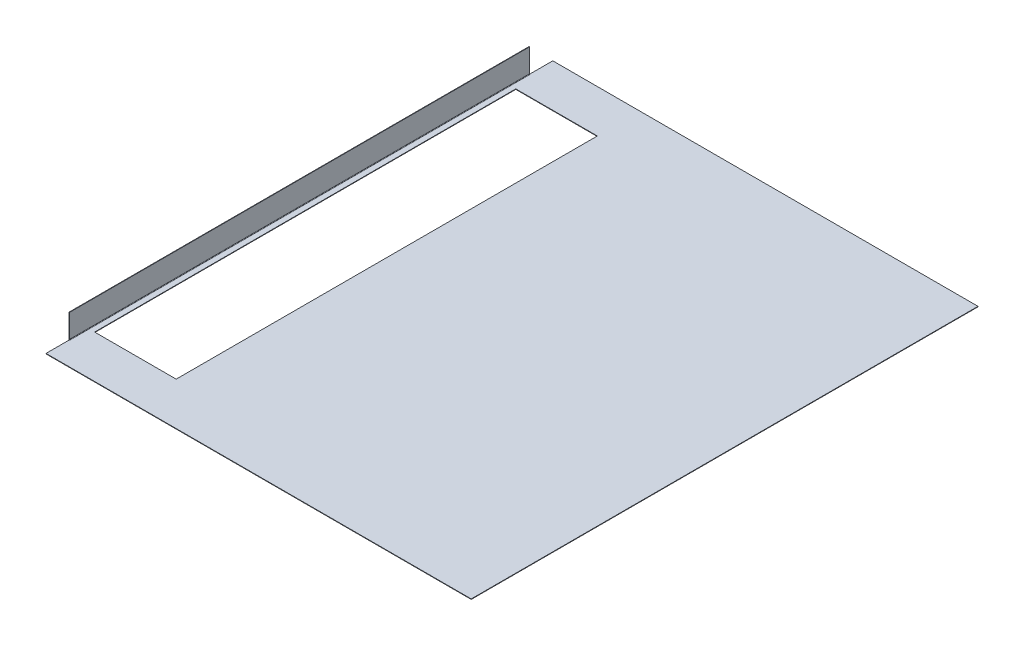
ISO-10303-21;
HEADER;
FILE_DESCRIPTION(('STEP AP214'),'2;1');
FILE_NAME('part.step','',(''),(''),'','','');
FILE_SCHEMA(('AUTOMOTIVE_DESIGN { 1 0 10303 214 1 1 1 1 }'));
ENDSEC;
DATA;
#1=APPLICATION_CONTEXT('core data for automotive mechanical design processes');
#2=APPLICATION_PROTOCOL_DEFINITION('international standard','automotive_design',2000,#1);
#3=PRODUCT_CONTEXT('',#1,'mechanical');
#4=PRODUCT('Part','Part','',(#3));
#5=PRODUCT_RELATED_PRODUCT_CATEGORY('part','',(#4));
#6=PRODUCT_DEFINITION_FORMATION('','',#4);
#7=PRODUCT_DEFINITION_CONTEXT('part definition',#1,'design');
#8=PRODUCT_DEFINITION('design','',#6,#7);
#9=PRODUCT_DEFINITION_SHAPE('','',#8);
#10=(LENGTH_UNIT() NAMED_UNIT(*) SI_UNIT(.MILLI.,.METRE.));
#11=(NAMED_UNIT(*) PLANE_ANGLE_UNIT() SI_UNIT($,.RADIAN.));
#12=(NAMED_UNIT(*) SI_UNIT($,.STERADIAN.) SOLID_ANGLE_UNIT());
#13=UNCERTAINTY_MEASURE_WITH_UNIT(LENGTH_MEASURE(1.E-05),#10,'distance_accuracy_value','');
#14=(GEOMETRIC_REPRESENTATION_CONTEXT(3) GLOBAL_UNCERTAINTY_ASSIGNED_CONTEXT((#13)) GLOBAL_UNIT_ASSIGNED_CONTEXT((#10,
#11,#12)) REPRESENTATION_CONTEXT('',''));
#15=CARTESIAN_POINT('',(0.,0.,0.));
#16=DIRECTION('',(0.,0.,1.));
#17=DIRECTION('',(1.,0.,0.));
#18=AXIS2_PLACEMENT_3D('',#15,#16,#17);
#19=CARTESIAN_POINT('',(-365.,0.,395.));
#20=DIRECTION('',(0.,0.,-1.));
#21=DIRECTION('',(-1.,0.,0.));
#22=AXIS2_PLACEMENT_3D('',#19,#20,#21);
#23=PLANE('',#22);
#24=DIRECTION('',(0.,-1.,0.));
#25=VECTOR('',#24,1.);
#26=CARTESIAN_POINT('',(-365.,0.,395.));
#27=LINE('',#26,#25);
#28=CARTESIAN_POINT('',(-365.,-0.585640646055121,395.));
#29=VERTEX_POINT('',#28);
#30=CARTESIAN_POINT('',(-365.,-0.8,395.));
#31=VERTEX_POINT('',#30);
#32=EDGE_CURVE('E52',#29,#31,#27,.T.);
#33=ORIENTED_EDGE('',*,*,#32,.F.);
#34=CARTESIAN_POINT('',(-364.2,0.800000000000026,395.));
#35=DIRECTION('',(0.,0.,1.));
#36=DIRECTION('',(1.,0.,0.));
#37=AXIS2_PLACEMENT_3D('',#34,#35,#36);
#38=CIRCLE('',#37,1.60000000000008);
#39=CARTESIAN_POINT('',(-364.2,-0.8,395.));
#40=VERTEX_POINT('',#39);
#41=EDGE_CURVE('E11',#29,#40,#38,.T.);
#42=ORIENTED_EDGE('',*,*,#41,.T.);
#43=DIRECTION('',(1.,0.,0.));
#44=VECTOR('',#43,1.);
#45=CARTESIAN_POINT('',(365.000000000058,-0.8,394.999999999949));
#46=LINE('',#45,#44);
#47=EDGE_CURVE('E230',#31,#40,#46,.T.);
#48=ORIENTED_EDGE('',*,*,#47,.F.);
#49=EDGE_LOOP('',(#33,#42,#48));
#50=FACE_BOUND('',#49,.T.);
#51=ADVANCED_FACE('F35',(#50),#23,.T.);
#52=CARTESIAN_POINT('',(-364.2,0.,-395.));
#53=DIRECTION('',(0.,0.,1.));
#54=DIRECTION('',(0.,-1.,0.));
#55=AXIS2_PLACEMENT_3D('',#52,#53,#54);
#56=PLANE('',#55);
#57=DIRECTION('',(-1.,0.,0.));
#58=VECTOR('',#57,1.);
#59=CARTESIAN_POINT('',(365.,-0.8,-395.));
#60=LINE('',#59,#58);
#61=CARTESIAN_POINT('',(-364.2,-0.8,-395.));
#62=VERTEX_POINT('',#61);
#63=CARTESIAN_POINT('',(-365.,-0.8,-395.));
#64=VERTEX_POINT('',#63);
#65=EDGE_CURVE('E219',#62,#64,#60,.T.);
#66=ORIENTED_EDGE('',*,*,#65,.F.);
#67=CARTESIAN_POINT('',(-364.2,0.800000000000026,-395.));
#68=DIRECTION('',(0.,0.,1.));
#69=DIRECTION('',(1.,0.,0.));
#70=AXIS2_PLACEMENT_3D('',#67,#68,#69);
#71=CIRCLE('',#70,1.60000000000008);
#72=CARTESIAN_POINT('',(-365.,-0.585640646055121,-395.));
#73=VERTEX_POINT('',#72);
#74=EDGE_CURVE('E207',#62,#73,#71,.F.);
#75=ORIENTED_EDGE('',*,*,#74,.T.);
#76=DIRECTION('',(0.,-1.,0.));
#77=VECTOR('',#76,1.);
#78=CARTESIAN_POINT('',(-365.,0.,-395.));
#79=LINE('',#78,#77);
#80=EDGE_CURVE('E223',#73,#64,#79,.T.);
#81=ORIENTED_EDGE('',*,*,#80,.T.);
#82=EDGE_LOOP('',(#66,#75,#81));
#83=FACE_BOUND('',#82,.T.);
#84=ADVANCED_FACE('F343',(#83),#56,.T.);
#85=CARTESIAN_POINT('',(-365.,-0.8,435.));
#86=DIRECTION('',(-1.,0.,0.));
#87=DIRECTION('',(0.,0.,1.));
#88=AXIS2_PLACEMENT_3D('',#85,#86,#87);
#89=PLANE('',#88);
#90=DIRECTION('',(0.,0.,1.));
#91=VECTOR('',#90,1.);
#92=CARTESIAN_POINT('',(-365.,0.,435.));
#93=LINE('',#92,#91);
#94=CARTESIAN_POINT('',(-365.,0.,395.));
#95=VERTEX_POINT('',#94);
#96=CARTESIAN_POINT('',(-365.,0.,435.));
#97=VERTEX_POINT('',#96);
#98=EDGE_CURVE('E284',#95,#97,#93,.T.);
#99=ORIENTED_EDGE('',*,*,#98,.F.);
#100=EDGE_CURVE('E220',#95,#29,#27,.T.);
#101=ORIENTED_EDGE('',*,*,#100,.T.);
#102=ORIENTED_EDGE('',*,*,#32,.T.);
#103=DIRECTION('',(0.,0.,1.));
#104=VECTOR('',#103,1.);
#105=CARTESIAN_POINT('',(-365.,-0.8,435.));
#106=LINE('',#105,#104);
#107=CARTESIAN_POINT('',(-365.,-0.8,435.));
#108=VERTEX_POINT('',#107);
#109=EDGE_CURVE('E272',#31,#108,#106,.T.);
#110=ORIENTED_EDGE('',*,*,#109,.T.);
#111=DIRECTION('',(0.,1.,0.));
#112=VECTOR('',#111,1.);
#113=CARTESIAN_POINT('',(-365.,-0.8,435.));
#114=LINE('',#113,#112);
#115=EDGE_CURVE('E290',#108,#97,#114,.T.);
#116=ORIENTED_EDGE('',*,*,#115,.T.);
#117=EDGE_LOOP('',(#99,#101,#102,#110,#116));
#118=FACE_BOUND('',#117,.T.);
#119=ADVANCED_FACE('F348',(#118),#89,.T.);
#120=CARTESIAN_POINT('',(-365.,-0.8,-435.));
#121=VERTEX_POINT('',#120);
#122=EDGE_CURVE('E273',#121,#64,#106,.T.);
#123=ORIENTED_EDGE('',*,*,#122,.T.);
#124=ORIENTED_EDGE('',*,*,#80,.F.);
#125=CARTESIAN_POINT('',(-365.,0.,-395.));
#126=VERTEX_POINT('',#125);
#127=EDGE_CURVE('E224',#126,#73,#79,.T.);
#128=ORIENTED_EDGE('',*,*,#127,.F.);
#129=CARTESIAN_POINT('',(-365.,0.,-435.));
#130=VERTEX_POINT('',#129);
#131=EDGE_CURVE('E285',#130,#126,#93,.T.);
#132=ORIENTED_EDGE('',*,*,#131,.F.);
#133=DIRECTION('',(0.,1.,0.));
#134=VECTOR('',#133,1.);
#135=CARTESIAN_POINT('',(-365.,-0.8,-435.));
#136=LINE('',#135,#134);
#137=EDGE_CURVE('E292',#121,#130,#136,.T.);
#138=ORIENTED_EDGE('',*,*,#137,.F.);
#139=EDGE_LOOP('',(#123,#124,#128,#132,#138));
#140=FACE_BOUND('',#139,.T.);
#141=ADVANCED_FACE('F315',(#140),#89,.T.);
#142=CARTESIAN_POINT('',(365.,-0.8,-435.));
#143=DIRECTION('',(0.,-1.,0.));
#144=DIRECTION('',(0.,0.,-1.));
#145=AXIS2_PLACEMENT_3D('',#142,#143,#144);
#146=PLANE('',#145);
#147=DIRECTION('',(0.,0.,-1.));
#148=VECTOR('',#147,1.);
#149=CARTESIAN_POINT('',(-215.,-0.8,361.5));
#150=LINE('',#149,#148);
#151=CARTESIAN_POINT('',(-215.,-0.8,361.5));
#152=VERTEX_POINT('',#151);
#153=CARTESIAN_POINT('',(-215.,-0.8,-361.5));
#154=VERTEX_POINT('',#153);
#155=EDGE_CURVE('E233',#152,#154,#150,.T.);
#156=ORIENTED_EDGE('',*,*,#155,.T.);
#157=DIRECTION('',(-1.,0.,0.));
#158=VECTOR('',#157,1.);
#159=CARTESIAN_POINT('',(-355.,-0.8,-361.5));
#160=LINE('',#159,#158);
#161=CARTESIAN_POINT('',(-355.,-0.8,-361.5));
#162=VERTEX_POINT('',#161);
#163=EDGE_CURVE('E236',#154,#162,#160,.T.);
#164=ORIENTED_EDGE('',*,*,#163,.T.);
#165=DIRECTION('',(0.,0.,1.));
#166=VECTOR('',#165,1.);
#167=CARTESIAN_POINT('',(-355.,-0.8,361.5));
#168=LINE('',#167,#166);
#169=CARTESIAN_POINT('',(-355.,-0.8,361.5));
#170=VERTEX_POINT('',#169);
#171=EDGE_CURVE('E240',#162,#170,#168,.T.);
#172=ORIENTED_EDGE('',*,*,#171,.T.);
#173=DIRECTION('',(1.,0.,0.));
#174=VECTOR('',#173,1.);
#175=CARTESIAN_POINT('',(-355.,-0.8,361.5));
#176=LINE('',#175,#174);
#177=EDGE_CURVE('E243',#170,#152,#176,.T.);
#178=ORIENTED_EDGE('',*,*,#177,.T.);
#179=EDGE_LOOP('',(#156,#164,#172,#178));
#180=FACE_BOUND('',#179,.T.);
#181=ORIENTED_EDGE('',*,*,#109,.F.);
#182=ORIENTED_EDGE('',*,*,#47,.T.);
#183=DIRECTION('',(0.,0.,1.));
#184=VECTOR('',#183,1.);
#185=CARTESIAN_POINT('',(-364.2,-0.800000000000052,395.));
#186=LINE('',#185,#184);
#187=EDGE_CURVE('E163',#40,#62,#186,.F.);
#188=ORIENTED_EDGE('',*,*,#187,.T.);
#189=ORIENTED_EDGE('',*,*,#65,.T.);
#190=ORIENTED_EDGE('',*,*,#122,.F.);
#191=DIRECTION('',(-1.,0.,0.));
#192=VECTOR('',#191,1.);
#193=CARTESIAN_POINT('',(-365.,-0.8,-435.));
#194=LINE('',#193,#192);
#195=CARTESIAN_POINT('',(365.,-0.8,-435.));
#196=VERTEX_POINT('',#195);
#197=EDGE_CURVE('E268',#196,#121,#194,.T.);
#198=ORIENTED_EDGE('',*,*,#197,.F.);
#199=DIRECTION('',(0.,0.,-1.));
#200=VECTOR('',#199,1.);
#201=CARTESIAN_POINT('',(365.,-0.8,435.));
#202=LINE('',#201,#200);
#203=CARTESIAN_POINT('',(365.,-0.8,435.));
#204=VERTEX_POINT('',#203);
#205=EDGE_CURVE('E265',#204,#196,#202,.T.);
#206=ORIENTED_EDGE('',*,*,#205,.F.);
#207=DIRECTION('',(1.,0.,0.));
#208=VECTOR('',#207,1.);
#209=CARTESIAN_POINT('',(-365.,-0.8,435.));
#210=LINE('',#209,#208);
#211=EDGE_CURVE('E276',#108,#204,#210,.T.);
#212=ORIENTED_EDGE('',*,*,#211,.F.);
#213=EDGE_LOOP('',(#181,#182,#188,#189,#190,#198,#206,#212));
#214=FACE_BOUND('',#213,.T.);
#215=ADVANCED_FACE('F311',(#180,#214),#146,.T.);
#216=CARTESIAN_POINT('',(365.,0.,-435.));
#217=DIRECTION('',(0.,-1.,0.));
#218=DIRECTION('',(0.,0.,-1.));
#219=AXIS2_PLACEMENT_3D('',#216,#217,#218);
#220=PLANE('',#219);
#221=DIRECTION('',(-1.,0.,0.));
#222=VECTOR('',#221,1.);
#223=CARTESIAN_POINT('',(-355.,0.,-361.5));
#224=LINE('',#223,#222);
#225=CARTESIAN_POINT('',(-215.,0.,-361.5));
#226=VERTEX_POINT('',#225);
#227=CARTESIAN_POINT('',(-355.,0.,-361.5));
#228=VERTEX_POINT('',#227);
#229=EDGE_CURVE('E248',#226,#228,#224,.T.);
#230=ORIENTED_EDGE('',*,*,#229,.F.);
#231=DIRECTION('',(0.,0.,-1.));
#232=VECTOR('',#231,1.);
#233=CARTESIAN_POINT('',(-215.,0.,361.5));
#234=LINE('',#233,#232);
#235=CARTESIAN_POINT('',(-215.,0.,361.5));
#236=VERTEX_POINT('',#235);
#237=EDGE_CURVE('E232',#236,#226,#234,.T.);
#238=ORIENTED_EDGE('',*,*,#237,.F.);
#239=DIRECTION('',(1.,0.,0.));
#240=VECTOR('',#239,1.);
#241=CARTESIAN_POINT('',(-355.,0.,361.5));
#242=LINE('',#241,#240);
#243=CARTESIAN_POINT('',(-355.,0.,361.5));
#244=VERTEX_POINT('',#243);
#245=EDGE_CURVE('E237',#244,#236,#242,.T.);
#246=ORIENTED_EDGE('',*,*,#245,.F.);
#247=DIRECTION('',(0.,0.,1.));
#248=VECTOR('',#247,1.);
#249=CARTESIAN_POINT('',(-355.,0.,361.5));
#250=LINE('',#249,#248);
#251=EDGE_CURVE('E251',#228,#244,#250,.T.);
#252=ORIENTED_EDGE('',*,*,#251,.F.);
#253=EDGE_LOOP('',(#230,#238,#246,#252));
#254=FACE_BOUND('',#253,.T.);
#255=DIRECTION('',(1.,-1.26038502551427E-13,0.));
#256=VECTOR('',#255,1.);
#257=CARTESIAN_POINT('',(-365.,0.,395.));
#258=LINE('',#257,#256);
#259=CARTESIAN_POINT('',(-364.2,0.,395.));
#260=VERTEX_POINT('',#259);
#261=EDGE_CURVE('E217',#95,#260,#258,.T.);
#262=ORIENTED_EDGE('',*,*,#261,.F.);
#263=ORIENTED_EDGE('',*,*,#98,.T.);
#264=DIRECTION('',(1.,0.,0.));
#265=VECTOR('',#264,1.);
#266=CARTESIAN_POINT('',(-365.,0.,435.));
#267=LINE('',#266,#265);
#268=CARTESIAN_POINT('',(365.,0.,435.));
#269=VERTEX_POINT('',#268);
#270=EDGE_CURVE('E269',#97,#269,#267,.T.);
#271=ORIENTED_EDGE('',*,*,#270,.T.);
#272=DIRECTION('',(0.,0.,-1.));
#273=VECTOR('',#272,1.);
#274=CARTESIAN_POINT('',(365.,0.,435.));
#275=LINE('',#274,#273);
#276=CARTESIAN_POINT('',(365.,0.,-435.));
#277=VERTEX_POINT('',#276);
#278=EDGE_CURVE('E258',#269,#277,#275,.T.);
#279=ORIENTED_EDGE('',*,*,#278,.T.);
#280=DIRECTION('',(-1.,0.,0.));
#281=VECTOR('',#280,1.);
#282=CARTESIAN_POINT('',(-365.,0.,-435.));
#283=LINE('',#282,#281);
#284=EDGE_CURVE('E281',#277,#130,#283,.T.);
#285=ORIENTED_EDGE('',*,*,#284,.T.);
#286=ORIENTED_EDGE('',*,*,#131,.T.);
#287=DIRECTION('',(-1.,0.,0.));
#288=VECTOR('',#287,1.);
#289=CARTESIAN_POINT('',(-364.2,0.,-395.));
#290=LINE('',#289,#288);
#291=CARTESIAN_POINT('',(-364.2,0.,-395.));
#292=VERTEX_POINT('',#291);
#293=EDGE_CURVE('E209',#292,#126,#290,.T.);
#294=ORIENTED_EDGE('',*,*,#293,.F.);
#295=DIRECTION('',(0.,0.,1.));
#296=VECTOR('',#295,1.);
#297=CARTESIAN_POINT('',(-364.2,0.,395.));
#298=LINE('',#297,#296);
#299=EDGE_CURVE('E213',#260,#292,#298,.F.);
#300=ORIENTED_EDGE('',*,*,#299,.F.);
#301=EDGE_LOOP('',(#262,#263,#271,#279,#285,#286,#294,#300));
#302=FACE_BOUND('',#301,.T.);
#303=ADVANCED_FACE('F302',(#254,#302),#220,.F.);
#304=CARTESIAN_POINT('',(365.,-0.8,435.));
#305=DIRECTION('',(1.,0.,0.));
#306=DIRECTION('',(0.,0.,-1.));
#307=AXIS2_PLACEMENT_3D('',#304,#305,#306);
#308=PLANE('',#307);
#309=ORIENTED_EDGE('',*,*,#278,.F.);
#310=DIRECTION('',(0.,1.,0.));
#311=VECTOR('',#310,1.);
#312=CARTESIAN_POINT('',(365.,-0.8,435.));
#313=LINE('',#312,#311);
#314=EDGE_CURVE('E44',#204,#269,#313,.T.);
#315=ORIENTED_EDGE('',*,*,#314,.F.);
#316=ORIENTED_EDGE('',*,*,#205,.T.);
#317=DIRECTION('',(0.,1.,0.));
#318=VECTOR('',#317,1.);
#319=CARTESIAN_POINT('',(365.,-0.8,-435.));
#320=LINE('',#319,#318);
#321=EDGE_CURVE('E39',#196,#277,#320,.T.);
#322=ORIENTED_EDGE('',*,*,#321,.T.);
#323=EDGE_LOOP('',(#309,#315,#316,#322));
#324=FACE_BOUND('',#323,.T.);
#325=ADVANCED_FACE('F37',(#324),#308,.T.);
#326=CARTESIAN_POINT('',(-365.,-0.8,435.));
#327=DIRECTION('',(0.,0.,1.));
#328=DIRECTION('',(1.,0.,0.));
#329=AXIS2_PLACEMENT_3D('',#326,#327,#328);
#330=PLANE('',#329);
#331=ORIENTED_EDGE('',*,*,#270,.F.);
#332=ORIENTED_EDGE('',*,*,#115,.F.);
#333=ORIENTED_EDGE('',*,*,#211,.T.);
#334=ORIENTED_EDGE('',*,*,#314,.T.);
#335=EDGE_LOOP('',(#331,#332,#333,#334));
#336=FACE_BOUND('',#335,.T.);
#337=ADVANCED_FACE('F307',(#336),#330,.T.);
#338=CARTESIAN_POINT('',(-365.,-0.8,-435.));
#339=DIRECTION('',(0.,0.,-1.));
#340=DIRECTION('',(-1.,0.,0.));
#341=AXIS2_PLACEMENT_3D('',#338,#339,#340);
#342=PLANE('',#341);
#343=ORIENTED_EDGE('',*,*,#284,.F.);
#344=ORIENTED_EDGE('',*,*,#321,.F.);
#345=ORIENTED_EDGE('',*,*,#197,.T.);
#346=ORIENTED_EDGE('',*,*,#137,.T.);
#347=EDGE_LOOP('',(#343,#344,#345,#346));
#348=FACE_BOUND('',#347,.T.);
#349=ADVANCED_FACE('F300',(#348),#342,.T.);
#350=CARTESIAN_POINT('',(-215.,-0.8,361.5));
#351=DIRECTION('',(1.,0.,0.));
#352=DIRECTION('',(0.,0.,-1.));
#353=AXIS2_PLACEMENT_3D('',#350,#351,#352);
#354=PLANE('',#353);
#355=ORIENTED_EDGE('',*,*,#237,.T.);
#356=DIRECTION('',(0.,1.,0.));
#357=VECTOR('',#356,1.);
#358=CARTESIAN_POINT('',(-215.,-0.8,-361.5));
#359=LINE('',#358,#357);
#360=EDGE_CURVE('E246',#154,#226,#359,.T.);
#361=ORIENTED_EDGE('',*,*,#360,.F.);
#362=ORIENTED_EDGE('',*,*,#155,.F.);
#363=DIRECTION('',(0.,1.,0.));
#364=VECTOR('',#363,1.);
#365=CARTESIAN_POINT('',(-215.,-0.8,361.5));
#366=LINE('',#365,#364);
#367=EDGE_CURVE('E256',#152,#236,#366,.T.);
#368=ORIENTED_EDGE('',*,*,#367,.T.);
#369=EDGE_LOOP('',(#355,#361,#362,#368));
#370=FACE_BOUND('',#369,.T.);
#371=ADVANCED_FACE('F357',(#370),#354,.F.);
#372=CARTESIAN_POINT('',(-355.,-0.8,361.5));
#373=DIRECTION('',(0.,0.,1.));
#374=DIRECTION('',(1.,0.,0.));
#375=AXIS2_PLACEMENT_3D('',#372,#373,#374);
#376=PLANE('',#375);
#377=ORIENTED_EDGE('',*,*,#245,.T.);
#378=ORIENTED_EDGE('',*,*,#367,.F.);
#379=ORIENTED_EDGE('',*,*,#177,.F.);
#380=DIRECTION('',(0.,1.,0.));
#381=VECTOR('',#380,1.);
#382=CARTESIAN_POINT('',(-355.,-0.8,361.5));
#383=LINE('',#382,#381);
#384=EDGE_CURVE('E259',#170,#244,#383,.T.);
#385=ORIENTED_EDGE('',*,*,#384,.T.);
#386=EDGE_LOOP('',(#377,#378,#379,#385));
#387=FACE_BOUND('',#386,.T.);
#388=ADVANCED_FACE('F353',(#387),#376,.F.);
#389=CARTESIAN_POINT('',(-355.,-0.8,361.5));
#390=DIRECTION('',(-1.,0.,0.));
#391=DIRECTION('',(0.,0.,1.));
#392=AXIS2_PLACEMENT_3D('',#389,#390,#391);
#393=PLANE('',#392);
#394=ORIENTED_EDGE('',*,*,#251,.T.);
#395=ORIENTED_EDGE('',*,*,#384,.F.);
#396=ORIENTED_EDGE('',*,*,#171,.F.);
#397=DIRECTION('',(0.,1.,0.));
#398=VECTOR('',#397,1.);
#399=CARTESIAN_POINT('',(-355.,-0.8,-361.5));
#400=LINE('',#399,#398);
#401=EDGE_CURVE('E261',#162,#228,#400,.T.);
#402=ORIENTED_EDGE('',*,*,#401,.T.);
#403=EDGE_LOOP('',(#394,#395,#396,#402));
#404=FACE_BOUND('',#403,.T.);
#405=ADVANCED_FACE('F356',(#404),#393,.F.);
#406=CARTESIAN_POINT('',(-355.,-0.8,-361.5));
#407=DIRECTION('',(0.,0.,-1.));
#408=DIRECTION('',(-1.,0.,0.));
#409=AXIS2_PLACEMENT_3D('',#406,#407,#408);
#410=PLANE('',#409);
#411=ORIENTED_EDGE('',*,*,#229,.T.);
#412=ORIENTED_EDGE('',*,*,#401,.F.);
#413=ORIENTED_EDGE('',*,*,#163,.F.);
#414=ORIENTED_EDGE('',*,*,#360,.T.);
#415=EDGE_LOOP('',(#411,#412,#413,#414));
#416=FACE_BOUND('',#415,.T.);
#417=ADVANCED_FACE('F361',(#416),#410,.F.);
#418=CARTESIAN_POINT('',(-364.2,0.800000000000026,395.));
#419=DIRECTION('',(0.,0.,-1.));
#420=DIRECTION('',(-1.,0.,0.));
#421=AXIS2_PLACEMENT_3D('',#418,#419,#420);
#422=PLANE('',#421);
#423=ORIENTED_EDGE('',*,*,#100,.F.);
#424=ORIENTED_EDGE('',*,*,#261,.T.);
#425=CARTESIAN_POINT('',(-364.2,0.800000000000026,395.));
#426=DIRECTION('',(0.,0.,1.));
#427=DIRECTION('',(1.,0.,0.));
#428=AXIS2_PLACEMENT_3D('',#425,#426,#427);
#429=CIRCLE('',#428,0.800000000000078);
#430=CARTESIAN_POINT('',(-365.,0.800000000000023,395.));
#431=VERTEX_POINT('',#430);
#432=EDGE_CURVE('E171',#431,#260,#429,.T.);
#433=ORIENTED_EDGE('',*,*,#432,.F.);
#434=DIRECTION('',(-1.,0.,0.));
#435=VECTOR('',#434,1.);
#436=CARTESIAN_POINT('',(-365.,0.800000000000023,395.));
#437=LINE('',#436,#435);
#438=CARTESIAN_POINT('',(-365.8,0.80000000000002,395.));
#439=VERTEX_POINT('',#438);
#440=EDGE_CURVE('E167',#431,#439,#437,.T.);
#441=ORIENTED_EDGE('',*,*,#440,.T.);
#442=EDGE_CURVE('E46',#439,#29,#38,.T.);
#443=ORIENTED_EDGE('',*,*,#442,.T.);
#444=EDGE_LOOP('',(#423,#424,#433,#441,#443));
#445=FACE_BOUND('',#444,.T.);
#446=ADVANCED_FACE('F168',(#445),#422,.F.);
#447=CARTESIAN_POINT('',(-364.2,0.800000000000026,-395.));
#448=DIRECTION('',(0.,0.,-1.));
#449=DIRECTION('',(-1.,0.,0.));
#450=AXIS2_PLACEMENT_3D('',#447,#448,#449);
#451=PLANE('',#450);
#452=CARTESIAN_POINT('',(-364.2,0.800000000000026,-395.));
#453=DIRECTION('',(0.,0.,1.));
#454=DIRECTION('',(1.,0.,0.));
#455=AXIS2_PLACEMENT_3D('',#452,#453,#454);
#456=CIRCLE('',#455,0.800000000000078);
#457=CARTESIAN_POINT('',(-365.,0.800000000000023,-395.));
#458=VERTEX_POINT('',#457);
#459=EDGE_CURVE('E164',#292,#458,#456,.F.);
#460=ORIENTED_EDGE('',*,*,#459,.F.);
#461=ORIENTED_EDGE('',*,*,#293,.T.);
#462=ORIENTED_EDGE('',*,*,#127,.T.);
#463=CARTESIAN_POINT('',(-365.8,0.80000000000002,-395.));
#464=VERTEX_POINT('',#463);
#465=EDGE_CURVE('E206',#73,#464,#71,.F.);
#466=ORIENTED_EDGE('',*,*,#465,.T.);
#467=DIRECTION('',(-1.,0.,0.));
#468=VECTOR('',#467,1.);
#469=CARTESIAN_POINT('',(-365.,0.800000000000023,-395.));
#470=LINE('',#469,#468);
#471=EDGE_CURVE('E323',#458,#464,#470,.T.);
#472=ORIENTED_EDGE('',*,*,#471,.F.);
#473=EDGE_LOOP('',(#460,#461,#462,#466,#472));
#474=FACE_BOUND('',#473,.T.);
#475=ADVANCED_FACE('F322',(#474),#451,.T.);
#476=CARTESIAN_POINT('',(-364.2,0.800000000000026,395.));
#477=DIRECTION('',(0.,0.,1.));
#478=DIRECTION('',(-1.,0.,0.));
#479=AXIS2_PLACEMENT_3D('',#476,#477,#478);
#480=CYLINDRICAL_SURFACE('',#479,1.60000000000008);
#481=ORIENTED_EDGE('',*,*,#187,.F.);
#482=ORIENTED_EDGE('',*,*,#41,.F.);
#483=ORIENTED_EDGE('',*,*,#442,.F.);
#484=DIRECTION('',(0.,0.,-1.));
#485=VECTOR('',#484,1.);
#486=CARTESIAN_POINT('',(-365.8,0.800000000000023,-395.));
#487=LINE('',#486,#485);
#488=EDGE_CURVE('E159',#439,#464,#487,.T.);
#489=ORIENTED_EDGE('',*,*,#488,.T.);
#490=ORIENTED_EDGE('',*,*,#465,.F.);
#491=ORIENTED_EDGE('',*,*,#74,.F.);
#492=EDGE_LOOP('',(#481,#482,#483,#489,#490,#491));
#493=FACE_BOUND('',#492,.T.);
#494=ADVANCED_FACE('F156',(#493),#480,.T.);
#495=CARTESIAN_POINT('',(-364.2,0.800000000000026,395.));
#496=DIRECTION('',(0.,0.,1.));
#497=DIRECTION('',(-1.,0.,0.));
#498=AXIS2_PLACEMENT_3D('',#495,#496,#497);
#499=CYLINDRICAL_SURFACE('',#498,0.800000000000078);
#500=ORIENTED_EDGE('',*,*,#299,.T.);
#501=ORIENTED_EDGE('',*,*,#459,.T.);
#502=DIRECTION('',(0.,0.,1.));
#503=VECTOR('',#502,1.);
#504=CARTESIAN_POINT('',(-365.,0.800000000000023,-395.));
#505=LINE('',#504,#503);
#506=EDGE_CURVE('E175',#458,#431,#505,.T.);
#507=ORIENTED_EDGE('',*,*,#506,.T.);
#508=ORIENTED_EDGE('',*,*,#432,.T.);
#509=EDGE_LOOP('',(#500,#501,#507,#508));
#510=FACE_BOUND('',#509,.T.);
#511=ADVANCED_FACE('F320',(#510),#499,.F.);
#512=CARTESIAN_POINT('',(-365.8,0.,-395.));
#513=DIRECTION('',(0.,0.,1.));
#514=DIRECTION('',(1.,0.,0.));
#515=AXIS2_PLACEMENT_3D('',#512,#513,#514);
#516=PLANE('',#515);
#517=ORIENTED_EDGE('',*,*,#471,.T.);
#518=DIRECTION('',(0.,-1.,0.));
#519=VECTOR('',#518,1.);
#520=CARTESIAN_POINT('',(-365.8,0.,-395.));
#521=LINE('',#520,#519);
#522=CARTESIAN_POINT('',(-365.8,40.8,-395.));
#523=VERTEX_POINT('',#522);
#524=EDGE_CURVE('E183',#523,#464,#521,.T.);
#525=ORIENTED_EDGE('',*,*,#524,.F.);
#526=DIRECTION('',(1.,0.,0.));
#527=VECTOR('',#526,1.);
#528=CARTESIAN_POINT('',(-365.8,40.8,-395.));
#529=LINE('',#528,#527);
#530=CARTESIAN_POINT('',(-365.,40.8,-395.));
#531=VERTEX_POINT('',#530);
#532=EDGE_CURVE('E192',#523,#531,#529,.T.);
#533=ORIENTED_EDGE('',*,*,#532,.T.);
#534=DIRECTION('',(0.,-1.,0.));
#535=VECTOR('',#534,1.);
#536=CARTESIAN_POINT('',(-365.,0.,-395.));
#537=LINE('',#536,#535);
#538=EDGE_CURVE('E184',#531,#458,#537,.T.);
#539=ORIENTED_EDGE('',*,*,#538,.T.);
#540=EDGE_LOOP('',(#517,#525,#533,#539));
#541=FACE_BOUND('',#540,.T.);
#542=ADVANCED_FACE('F331',(#541),#516,.F.);
#543=CARTESIAN_POINT('',(-365.8,40.8,395.));
#544=DIRECTION('',(0.,0.,-1.));
#545=DIRECTION('',(-1.,0.,0.));
#546=AXIS2_PLACEMENT_3D('',#543,#544,#545);
#547=PLANE('',#546);
#548=ORIENTED_EDGE('',*,*,#440,.F.);
#549=DIRECTION('',(0.,1.,0.));
#550=VECTOR('',#549,1.);
#551=CARTESIAN_POINT('',(-365.,40.8,395.));
#552=LINE('',#551,#550);
#553=CARTESIAN_POINT('',(-365.,40.8,395.));
#554=VERTEX_POINT('',#553);
#555=EDGE_CURVE('E199',#431,#554,#552,.T.);
#556=ORIENTED_EDGE('',*,*,#555,.T.);
#557=DIRECTION('',(1.,0.,0.));
#558=VECTOR('',#557,1.);
#559=CARTESIAN_POINT('',(-365.8,40.8,395.));
#560=LINE('',#559,#558);
#561=CARTESIAN_POINT('',(-365.8,40.8,395.));
#562=VERTEX_POINT('',#561);
#563=EDGE_CURVE('E188',#562,#554,#560,.T.);
#564=ORIENTED_EDGE('',*,*,#563,.F.);
#565=DIRECTION('',(0.,1.,0.));
#566=VECTOR('',#565,1.);
#567=CARTESIAN_POINT('',(-365.8,40.8,395.));
#568=LINE('',#567,#566);
#569=EDGE_CURVE('E180',#439,#562,#568,.T.);
#570=ORIENTED_EDGE('',*,*,#569,.F.);
#571=EDGE_LOOP('',(#548,#556,#564,#570));
#572=FACE_BOUND('',#571,.T.);
#573=ADVANCED_FACE('F186',(#572),#547,.F.);
#574=CARTESIAN_POINT('',(-365.8,40.8,-395.));
#575=DIRECTION('',(1.,0.,0.));
#576=DIRECTION('',(0.,1.,0.));
#577=AXIS2_PLACEMENT_3D('',#574,#575,#576);
#578=PLANE('',#577);
#579=ORIENTED_EDGE('',*,*,#488,.F.);
#580=ORIENTED_EDGE('',*,*,#569,.T.);
#581=DIRECTION('',(0.,0.,-1.));
#582=VECTOR('',#581,1.);
#583=CARTESIAN_POINT('',(-365.8,40.8,-395.));
#584=LINE('',#583,#582);
#585=EDGE_CURVE('E190',#562,#523,#584,.T.);
#586=ORIENTED_EDGE('',*,*,#585,.T.);
#587=ORIENTED_EDGE('',*,*,#524,.T.);
#588=EDGE_LOOP('',(#579,#580,#586,#587));
#589=FACE_BOUND('',#588,.T.);
#590=ADVANCED_FACE('F179',(#589),#578,.F.);
#591=CARTESIAN_POINT('',(-365.,40.8,-395.));
#592=DIRECTION('',(1.,0.,0.));
#593=DIRECTION('',(0.,1.,0.));
#594=AXIS2_PLACEMENT_3D('',#591,#592,#593);
#595=PLANE('',#594);
#596=ORIENTED_EDGE('',*,*,#555,.F.);
#597=ORIENTED_EDGE('',*,*,#506,.F.);
#598=ORIENTED_EDGE('',*,*,#538,.F.);
#599=DIRECTION('',(0.,0.,-1.));
#600=VECTOR('',#599,1.);
#601=CARTESIAN_POINT('',(-365.,40.8,-395.));
#602=LINE('',#601,#600);
#603=EDGE_CURVE('E194',#554,#531,#602,.T.);
#604=ORIENTED_EDGE('',*,*,#603,.F.);
#605=EDGE_LOOP('',(#596,#597,#598,#604));
#606=FACE_BOUND('',#605,.T.);
#607=ADVANCED_FACE('F329',(#606),#595,.T.);
#608=CARTESIAN_POINT('',(-365.8,40.8,-395.));
#609=DIRECTION('',(0.,-1.,0.));
#610=DIRECTION('',(1.,0.,0.));
#611=AXIS2_PLACEMENT_3D('',#608,#609,#610);
#612=PLANE('',#611);
#613=ORIENTED_EDGE('',*,*,#603,.T.);
#614=ORIENTED_EDGE('',*,*,#532,.F.);
#615=ORIENTED_EDGE('',*,*,#585,.F.);
#616=ORIENTED_EDGE('',*,*,#563,.T.);
#617=EDGE_LOOP('',(#613,#614,#615,#616));
#618=FACE_BOUND('',#617,.T.);
#619=ADVANCED_FACE('F334',(#618),#612,.F.);
#620=CLOSED_SHELL('',(#51,#84,#119,#141,#215,#303,#325,#337,#349,#371,#388,#405,#417,#446,#475,
#494,#511,#542,#573,#590,#607,#619));
#621=MANIFOLD_SOLID_BREP('B2',#620);
#622=ADVANCED_BREP_SHAPE_REPRESENTATION('',(#18,#621),#14);
#623=SHAPE_DEFINITION_REPRESENTATION(#9,#622);
ENDSEC;
END-ISO-10303-21;
